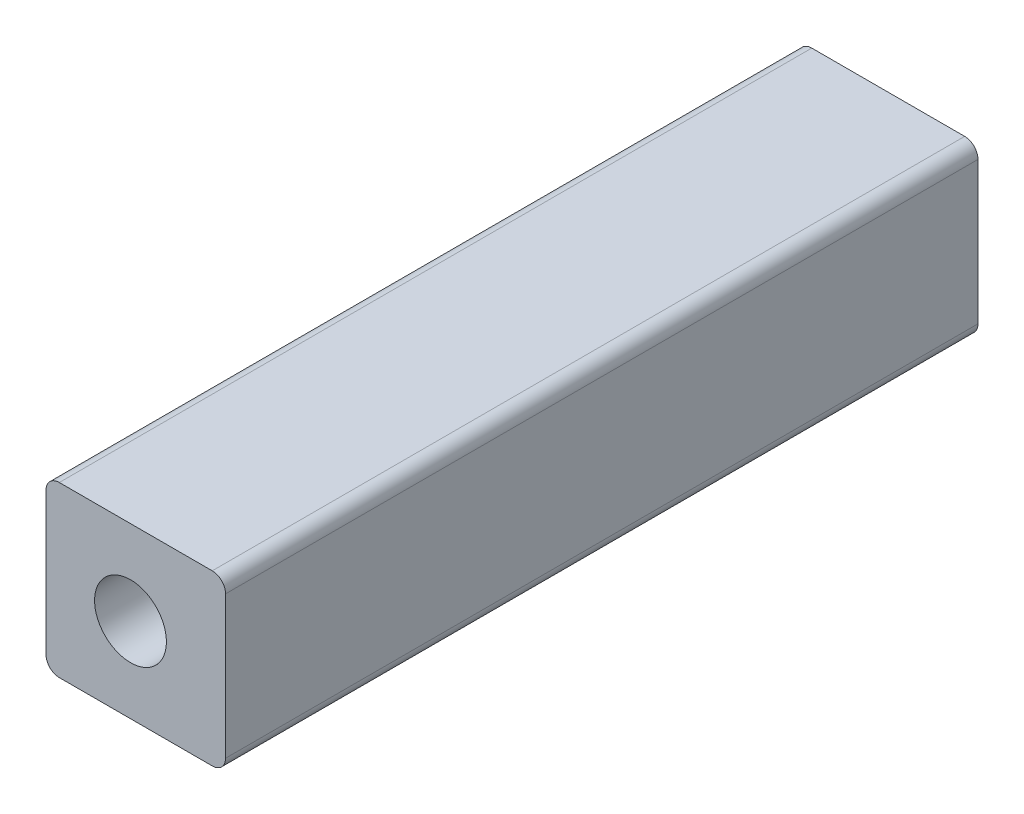
ISO-10303-21;
HEADER;
FILE_DESCRIPTION(('STEP AP214'),'2;1');
FILE_NAME('part.step','',(''),(''),'','','');
FILE_SCHEMA(('AUTOMOTIVE_DESIGN { 1 0 10303 214 1 1 1 1 }'));
ENDSEC;
DATA;
#1=APPLICATION_CONTEXT('core data for automotive mechanical design processes');
#2=APPLICATION_PROTOCOL_DEFINITION('international standard','automotive_design',2000,#1);
#3=PRODUCT_CONTEXT('',#1,'mechanical');
#4=PRODUCT('Part','Part','',(#3));
#5=PRODUCT_RELATED_PRODUCT_CATEGORY('part','',(#4));
#6=PRODUCT_DEFINITION_FORMATION('','',#4);
#7=PRODUCT_DEFINITION_CONTEXT('part definition',#1,'design');
#8=PRODUCT_DEFINITION('design','',#6,#7);
#9=PRODUCT_DEFINITION_SHAPE('','',#8);
#10=(LENGTH_UNIT() NAMED_UNIT(*) SI_UNIT(.MILLI.,.METRE.));
#11=(NAMED_UNIT(*) PLANE_ANGLE_UNIT() SI_UNIT($,.RADIAN.));
#12=(NAMED_UNIT(*) SI_UNIT($,.STERADIAN.) SOLID_ANGLE_UNIT());
#13=UNCERTAINTY_MEASURE_WITH_UNIT(LENGTH_MEASURE(1.E-05),#10,'distance_accuracy_value','');
#14=(GEOMETRIC_REPRESENTATION_CONTEXT(3) GLOBAL_UNCERTAINTY_ASSIGNED_CONTEXT((#13)) GLOBAL_UNIT_ASSIGNED_CONTEXT((#10,
#11,#12)) REPRESENTATION_CONTEXT('',''));
#15=CARTESIAN_POINT('',(0.,0.,0.));
#16=DIRECTION('',(0.,0.,1.));
#17=DIRECTION('',(1.,0.,0.));
#18=AXIS2_PLACEMENT_3D('',#15,#16,#17);
#19=CARTESIAN_POINT('',(0.,0.,28.275));
#20=DIRECTION('',(0.,0.,1.));
#21=DIRECTION('',(1.,0.,0.));
#22=AXIS2_PLACEMENT_3D('',#19,#20,#21);
#23=PLANE('',#22);
#24=DIRECTION('',(0.,-1.,0.));
#25=VECTOR('',#24,1.);
#26=CARTESIAN_POINT('',(7.14375,6.35,28.275));
#27=LINE('',#26,#25);
#28=CARTESIAN_POINT('',(7.14375,5.35,28.275));
#29=VERTEX_POINT('',#28);
#30=CARTESIAN_POINT('',(7.14375,-5.35,28.275));
#31=VERTEX_POINT('',#30);
#32=EDGE_CURVE('E127',#29,#31,#27,.T.);
#33=ORIENTED_EDGE('',*,*,#32,.F.);
#34=CARTESIAN_POINT('',(6.14375,5.35,28.275));
#35=DIRECTION('',(0.,0.,1.));
#36=DIRECTION('',(1.,0.,0.));
#37=AXIS2_PLACEMENT_3D('',#34,#35,#36);
#38=CIRCLE('',#37,1.);
#39=CARTESIAN_POINT('',(6.14375,6.35,28.275));
#40=VERTEX_POINT('',#39);
#41=EDGE_CURVE('E166',#29,#40,#38,.T.);
#42=ORIENTED_EDGE('',*,*,#41,.T.);
#43=DIRECTION('',(-1.,0.,0.));
#44=VECTOR('',#43,1.);
#45=CARTESIAN_POINT('',(-6.35,6.35,28.275));
#46=LINE('',#45,#44);
#47=CARTESIAN_POINT('',(-5.35,6.35,28.275));
#48=VERTEX_POINT('',#47);
#49=EDGE_CURVE('E145',#40,#48,#46,.T.);
#50=ORIENTED_EDGE('',*,*,#49,.T.);
#51=CARTESIAN_POINT('',(-5.35,5.35,28.275));
#52=DIRECTION('',(0.,0.,1.));
#53=DIRECTION('',(1.,0.,0.));
#54=AXIS2_PLACEMENT_3D('',#51,#52,#53);
#55=CIRCLE('',#54,1.);
#56=CARTESIAN_POINT('',(-6.35,5.35,28.275));
#57=VERTEX_POINT('',#56);
#58=EDGE_CURVE('E160',#48,#57,#55,.T.);
#59=ORIENTED_EDGE('',*,*,#58,.T.);
#60=DIRECTION('',(0.,-1.,0.));
#61=VECTOR('',#60,1.);
#62=CARTESIAN_POINT('',(-6.35,6.35,28.275));
#63=LINE('',#62,#61);
#64=CARTESIAN_POINT('',(-6.35,-5.35,28.275));
#65=VERTEX_POINT('',#64);
#66=EDGE_CURVE('E148',#57,#65,#63,.T.);
#67=ORIENTED_EDGE('',*,*,#66,.T.);
#68=CARTESIAN_POINT('',(-5.35,-5.35,28.275));
#69=DIRECTION('',(0.,0.,1.));
#70=DIRECTION('',(1.,0.,0.));
#71=AXIS2_PLACEMENT_3D('',#68,#69,#70);
#72=CIRCLE('',#71,1.);
#73=CARTESIAN_POINT('',(-5.35,-6.35,28.275));
#74=VERTEX_POINT('',#73);
#75=EDGE_CURVE('E162',#65,#74,#72,.T.);
#76=ORIENTED_EDGE('',*,*,#75,.T.);
#77=DIRECTION('',(1.,0.,0.));
#78=VECTOR('',#77,1.);
#79=CARTESIAN_POINT('',(-6.35,-6.35,28.275));
#80=LINE('',#79,#78);
#81=CARTESIAN_POINT('',(6.14375,-6.35,28.275));
#82=VERTEX_POINT('',#81);
#83=EDGE_CURVE('E129',#74,#82,#80,.T.);
#84=ORIENTED_EDGE('',*,*,#83,.T.);
#85=CARTESIAN_POINT('',(6.14375,-5.35,28.275));
#86=DIRECTION('',(0.,0.,1.));
#87=DIRECTION('',(1.,0.,0.));
#88=AXIS2_PLACEMENT_3D('',#85,#86,#87);
#89=CIRCLE('',#88,1.);
#90=EDGE_CURVE('E164',#82,#31,#89,.T.);
#91=ORIENTED_EDGE('',*,*,#90,.T.);
#92=EDGE_LOOP('',(#33,#42,#50,#59,#67,#76,#84,#91));
#93=FACE_BOUND('',#92,.T.);
#94=CARTESIAN_POINT('',(0.,0.,28.275));
#95=DIRECTION('',(0.,0.,1.));
#96=DIRECTION('',(1.,0.,0.));
#97=AXIS2_PLACEMENT_3D('',#94,#95,#96);
#98=CIRCLE('',#97,2.7);
#99=CARTESIAN_POINT('',(2.7,0.,28.275));
#100=VERTEX_POINT('',#99);
#101=EDGE_CURVE('E139',#100,#100,#98,.T.);
#102=ORIENTED_EDGE('',*,*,#101,.F.);
#103=EDGE_LOOP('',(#102));
#104=FACE_BOUND('',#103,.T.);
#105=ADVANCED_FACE('F43',(#93,#104),#23,.T.);
#106=CARTESIAN_POINT('',(0.,0.,-28.275));
#107=DIRECTION('',(0.,0.,1.));
#108=DIRECTION('',(1.,0.,0.));
#109=AXIS2_PLACEMENT_3D('',#106,#107,#108);
#110=PLANE('',#109);
#111=DIRECTION('',(-1.,0.,0.));
#112=VECTOR('',#111,1.);
#113=CARTESIAN_POINT('',(-6.35,6.35,-28.275));
#114=LINE('',#113,#112);
#115=CARTESIAN_POINT('',(6.14375,6.35,-28.275));
#116=VERTEX_POINT('',#115);
#117=CARTESIAN_POINT('',(-5.35,6.35,-28.275));
#118=VERTEX_POINT('',#117);
#119=EDGE_CURVE('E142',#116,#118,#114,.T.);
#120=ORIENTED_EDGE('',*,*,#119,.F.);
#121=CARTESIAN_POINT('',(6.14375,5.35,-28.275));
#122=DIRECTION('',(0.,0.,1.));
#123=DIRECTION('',(1.,0.,0.));
#124=AXIS2_PLACEMENT_3D('',#121,#122,#123);
#125=CIRCLE('',#124,1.);
#126=CARTESIAN_POINT('',(7.14375,5.35,-28.275));
#127=VERTEX_POINT('',#126);
#128=EDGE_CURVE('E117',#116,#127,#125,.F.);
#129=ORIENTED_EDGE('',*,*,#128,.T.);
#130=DIRECTION('',(0.,1.,0.));
#131=VECTOR('',#130,1.);
#132=CARTESIAN_POINT('',(7.14375,-6.35,-28.275));
#133=LINE('',#132,#131);
#134=CARTESIAN_POINT('',(7.14375,-5.35,-28.275));
#135=VERTEX_POINT('',#134);
#136=EDGE_CURVE('E124',#135,#127,#133,.T.);
#137=ORIENTED_EDGE('',*,*,#136,.F.);
#138=CARTESIAN_POINT('',(6.14375,-5.35,-28.275));
#139=DIRECTION('',(0.,0.,1.));
#140=DIRECTION('',(1.,0.,0.));
#141=AXIS2_PLACEMENT_3D('',#138,#139,#140);
#142=CIRCLE('',#141,1.);
#143=CARTESIAN_POINT('',(6.14375,-6.35,-28.275));
#144=VERTEX_POINT('',#143);
#145=EDGE_CURVE('E109',#135,#144,#142,.F.);
#146=ORIENTED_EDGE('',*,*,#145,.T.);
#147=DIRECTION('',(1.,0.,0.));
#148=VECTOR('',#147,1.);
#149=CARTESIAN_POINT('',(-6.35,-6.35,-28.275));
#150=LINE('',#149,#148);
#151=CARTESIAN_POINT('',(-5.35,-6.35,-28.275));
#152=VERTEX_POINT('',#151);
#153=EDGE_CURVE('E149',#152,#144,#150,.T.);
#154=ORIENTED_EDGE('',*,*,#153,.F.);
#155=CARTESIAN_POINT('',(-5.35,-5.35,-28.275));
#156=DIRECTION('',(0.,0.,1.));
#157=DIRECTION('',(1.,0.,0.));
#158=AXIS2_PLACEMENT_3D('',#155,#156,#157);
#159=CIRCLE('',#158,1.);
#160=CARTESIAN_POINT('',(-6.35,-5.35,-28.275));
#161=VERTEX_POINT('',#160);
#162=EDGE_CURVE('E58',#152,#161,#159,.F.);
#163=ORIENTED_EDGE('',*,*,#162,.T.);
#164=DIRECTION('',(0.,-1.,0.));
#165=VECTOR('',#164,1.);
#166=CARTESIAN_POINT('',(-6.35,6.35,-28.275));
#167=LINE('',#166,#165);
#168=CARTESIAN_POINT('',(-6.35,5.35,-28.275));
#169=VERTEX_POINT('',#168);
#170=EDGE_CURVE('E156',#169,#161,#167,.T.);
#171=ORIENTED_EDGE('',*,*,#170,.F.);
#172=CARTESIAN_POINT('',(-5.35,5.35,-28.275));
#173=DIRECTION('',(0.,0.,1.));
#174=DIRECTION('',(1.,0.,0.));
#175=AXIS2_PLACEMENT_3D('',#172,#173,#174);
#176=CIRCLE('',#175,1.);
#177=EDGE_CURVE('E66',#169,#118,#176,.F.);
#178=ORIENTED_EDGE('',*,*,#177,.T.);
#179=EDGE_LOOP('',(#120,#129,#137,#146,#154,#163,#171,#178));
#180=FACE_BOUND('',#179,.T.);
#181=CARTESIAN_POINT('',(0.,0.,-28.275));
#182=DIRECTION('',(0.,0.,1.));
#183=DIRECTION('',(1.,0.,0.));
#184=AXIS2_PLACEMENT_3D('',#181,#182,#183);
#185=CIRCLE('',#184,2.7);
#186=CARTESIAN_POINT('',(2.7,0.,-28.275));
#187=VERTEX_POINT('',#186);
#188=EDGE_CURVE('E136',#187,#187,#185,.T.);
#189=ORIENTED_EDGE('',*,*,#188,.T.);
#190=EDGE_LOOP('',(#189));
#191=FACE_BOUND('',#190,.T.);
#192=ADVANCED_FACE('F132',(#180,#191),#110,.F.);
#193=CARTESIAN_POINT('',(-6.35,6.35,28.275));
#194=DIRECTION('',(0.,-1.,0.));
#195=DIRECTION('',(0.,0.,-1.));
#196=AXIS2_PLACEMENT_3D('',#193,#194,#195);
#197=PLANE('',#196);
#198=ORIENTED_EDGE('',*,*,#49,.F.);
#199=DIRECTION('',(0.,0.,1.));
#200=VECTOR('',#199,1.);
#201=CARTESIAN_POINT('',(6.14375,6.35,-28.275));
#202=LINE('',#201,#200);
#203=EDGE_CURVE('E170',#40,#116,#202,.F.);
#204=ORIENTED_EDGE('',*,*,#203,.T.);
#205=ORIENTED_EDGE('',*,*,#119,.T.);
#206=DIRECTION('',(0.,0.,-1.));
#207=VECTOR('',#206,1.);
#208=CARTESIAN_POINT('',(-5.35,6.35,28.275));
#209=LINE('',#208,#207);
#210=EDGE_CURVE('E168',#118,#48,#209,.F.);
#211=ORIENTED_EDGE('',*,*,#210,.T.);
#212=EDGE_LOOP('',(#198,#204,#205,#211));
#213=FACE_BOUND('',#212,.T.);
#214=ADVANCED_FACE('F185',(#213),#197,.F.);
#215=CARTESIAN_POINT('',(-6.35,6.35,28.275));
#216=DIRECTION('',(1.,0.,0.));
#217=DIRECTION('',(0.,1.,0.));
#218=AXIS2_PLACEMENT_3D('',#215,#216,#217);
#219=PLANE('',#218);
#220=ORIENTED_EDGE('',*,*,#170,.T.);
#221=DIRECTION('',(0.,0.,-1.));
#222=VECTOR('',#221,1.);
#223=CARTESIAN_POINT('',(-6.35,-5.35,28.275));
#224=LINE('',#223,#222);
#225=EDGE_CURVE('E11',#161,#65,#224,.F.);
#226=ORIENTED_EDGE('',*,*,#225,.T.);
#227=ORIENTED_EDGE('',*,*,#66,.F.);
#228=DIRECTION('',(0.,0.,-1.));
#229=VECTOR('',#228,1.);
#230=CARTESIAN_POINT('',(-6.35,5.35,28.275));
#231=LINE('',#230,#229);
#232=EDGE_CURVE('E51',#57,#169,#231,.T.);
#233=ORIENTED_EDGE('',*,*,#232,.T.);
#234=EDGE_LOOP('',(#220,#226,#227,#233));
#235=FACE_BOUND('',#234,.T.);
#236=ADVANCED_FACE('F180',(#235),#219,.F.);
#237=CARTESIAN_POINT('',(-6.35,-6.35,28.275));
#238=DIRECTION('',(0.,1.,0.));
#239=DIRECTION('',(0.,0.,1.));
#240=AXIS2_PLACEMENT_3D('',#237,#238,#239);
#241=PLANE('',#240);
#242=ORIENTED_EDGE('',*,*,#153,.T.);
#243=DIRECTION('',(0.,0.,-1.));
#244=VECTOR('',#243,1.);
#245=CARTESIAN_POINT('',(6.14375,-6.35,28.275));
#246=LINE('',#245,#244);
#247=EDGE_CURVE('E114',#144,#82,#246,.F.);
#248=ORIENTED_EDGE('',*,*,#247,.T.);
#249=ORIENTED_EDGE('',*,*,#83,.F.);
#250=DIRECTION('',(0.,0.,-1.));
#251=VECTOR('',#250,1.);
#252=CARTESIAN_POINT('',(-5.35,-6.35,28.275));
#253=LINE('',#252,#251);
#254=EDGE_CURVE('E175',#74,#152,#253,.T.);
#255=ORIENTED_EDGE('',*,*,#254,.T.);
#256=EDGE_LOOP('',(#242,#248,#249,#255));
#257=FACE_BOUND('',#256,.T.);
#258=ADVANCED_FACE('F195',(#257),#241,.F.);
#259=CARTESIAN_POINT('',(0.,0.,28.275));
#260=DIRECTION('',(0.,0.,-1.));
#261=DIRECTION('',(-1.,0.,0.));
#262=AXIS2_PLACEMENT_3D('',#259,#260,#261);
#263=CYLINDRICAL_SURFACE('',#262,2.7);
#264=ORIENTED_EDGE('',*,*,#101,.T.);
#265=EDGE_LOOP('',(#264));
#266=FACE_BOUND('',#265,.T.);
#267=ORIENTED_EDGE('',*,*,#188,.F.);
#268=EDGE_LOOP('',(#267));
#269=FACE_BOUND('',#268,.T.);
#270=ADVANCED_FACE('F212',(#266,#269),#263,.F.);
#271=CARTESIAN_POINT('',(7.14375,0.,0.));
#272=DIRECTION('',(1.,0.,0.));
#273=DIRECTION('',(0.,1.,0.));
#274=AXIS2_PLACEMENT_3D('',#271,#272,#273);
#275=PLANE('',#274);
#276=ORIENTED_EDGE('',*,*,#136,.T.);
#277=DIRECTION('',(0.,0.,1.));
#278=VECTOR('',#277,1.);
#279=CARTESIAN_POINT('',(7.14375,5.35,28.275));
#280=LINE('',#279,#278);
#281=EDGE_CURVE('E128',#127,#29,#280,.T.);
#282=ORIENTED_EDGE('',*,*,#281,.T.);
#283=ORIENTED_EDGE('',*,*,#32,.T.);
#284=DIRECTION('',(0.,0.,-1.));
#285=VECTOR('',#284,1.);
#286=CARTESIAN_POINT('',(7.14375,-5.35,-28.275));
#287=LINE('',#286,#285);
#288=EDGE_CURVE('E113',#31,#135,#287,.T.);
#289=ORIENTED_EDGE('',*,*,#288,.T.);
#290=EDGE_LOOP('',(#276,#282,#283,#289));
#291=FACE_BOUND('',#290,.T.);
#292=ADVANCED_FACE('F122',(#291),#275,.T.);
#293=CARTESIAN_POINT('',(6.14375,5.35,0.));
#294=DIRECTION('',(0.,0.,-1.));
#295=DIRECTION('',(-1.,0.,0.));
#296=AXIS2_PLACEMENT_3D('',#293,#294,#295);
#297=CYLINDRICAL_SURFACE('',#296,1.);
#298=ORIENTED_EDGE('',*,*,#128,.F.);
#299=ORIENTED_EDGE('',*,*,#203,.F.);
#300=ORIENTED_EDGE('',*,*,#41,.F.);
#301=ORIENTED_EDGE('',*,*,#281,.F.);
#302=EDGE_LOOP('',(#298,#299,#300,#301));
#303=FACE_BOUND('',#302,.T.);
#304=ADVANCED_FACE('F191',(#303),#297,.T.);
#305=CARTESIAN_POINT('',(6.14375,-5.35,0.));
#306=DIRECTION('',(0.,0.,1.));
#307=DIRECTION('',(1.,0.,0.));
#308=AXIS2_PLACEMENT_3D('',#305,#306,#307);
#309=CYLINDRICAL_SURFACE('',#308,1.);
#310=ORIENTED_EDGE('',*,*,#90,.F.);
#311=ORIENTED_EDGE('',*,*,#247,.F.);
#312=ORIENTED_EDGE('',*,*,#145,.F.);
#313=ORIENTED_EDGE('',*,*,#288,.F.);
#314=EDGE_LOOP('',(#310,#311,#312,#313));
#315=FACE_BOUND('',#314,.T.);
#316=ADVANCED_FACE('F112',(#315),#309,.T.);
#317=CARTESIAN_POINT('',(-5.35,-5.35,28.275));
#318=DIRECTION('',(0.,0.,-1.));
#319=DIRECTION('',(-1.,0.,0.));
#320=AXIS2_PLACEMENT_3D('',#317,#318,#319);
#321=CYLINDRICAL_SURFACE('',#320,1.);
#322=ORIENTED_EDGE('',*,*,#75,.F.);
#323=ORIENTED_EDGE('',*,*,#225,.F.);
#324=ORIENTED_EDGE('',*,*,#162,.F.);
#325=ORIENTED_EDGE('',*,*,#254,.F.);
#326=EDGE_LOOP('',(#322,#323,#324,#325));
#327=FACE_BOUND('',#326,.T.);
#328=ADVANCED_FACE('F197',(#327),#321,.T.);
#329=CARTESIAN_POINT('',(-5.35,5.35,28.275));
#330=DIRECTION('',(0.,0.,-1.));
#331=DIRECTION('',(-1.,0.,0.));
#332=AXIS2_PLACEMENT_3D('',#329,#330,#331);
#333=CYLINDRICAL_SURFACE('',#332,1.);
#334=ORIENTED_EDGE('',*,*,#58,.F.);
#335=ORIENTED_EDGE('',*,*,#210,.F.);
#336=ORIENTED_EDGE('',*,*,#177,.F.);
#337=ORIENTED_EDGE('',*,*,#232,.F.);
#338=EDGE_LOOP('',(#334,#335,#336,#337));
#339=FACE_BOUND('',#338,.T.);
#340=ADVANCED_FACE('F45',(#339),#333,.T.);
#341=CLOSED_SHELL('',(#105,#192,#214,#236,#258,#270,#292,#304,#316,#328,#340));
#342=MANIFOLD_SOLID_BREP('B2',#341);
#343=ADVANCED_BREP_SHAPE_REPRESENTATION('',(#18,#342),#14);
#344=SHAPE_DEFINITION_REPRESENTATION(#9,#343);
ENDSEC;
END-ISO-10303-21;
